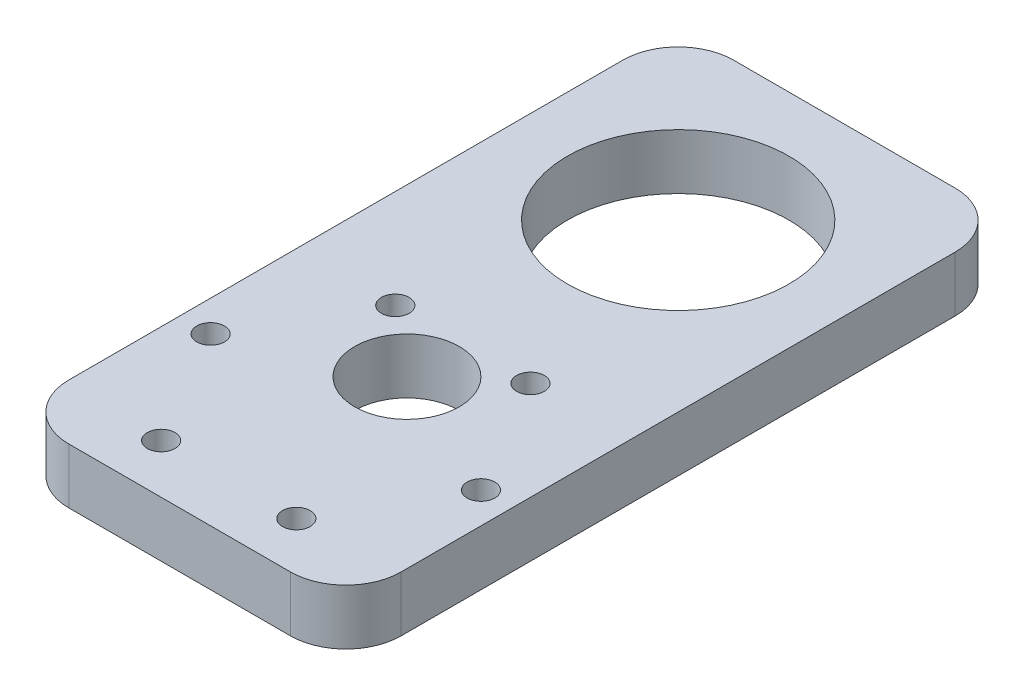
ISO-10303-21;
HEADER;
FILE_DESCRIPTION(('STEP AP214'),'2;1');
FILE_NAME('part.step','',(''),(''),'','','');
FILE_SCHEMA(('AUTOMOTIVE_DESIGN { 1 0 10303 214 1 1 1 1 }'));
ENDSEC;
DATA;
#1=APPLICATION_CONTEXT('core data for automotive mechanical design processes');
#2=APPLICATION_PROTOCOL_DEFINITION('international standard','automotive_design',2000,#1);
#3=PRODUCT_CONTEXT('',#1,'mechanical');
#4=PRODUCT('Part','Part','',(#3));
#5=PRODUCT_RELATED_PRODUCT_CATEGORY('part','',(#4));
#6=PRODUCT_DEFINITION_FORMATION('','',#4);
#7=PRODUCT_DEFINITION_CONTEXT('part definition',#1,'design');
#8=PRODUCT_DEFINITION('design','',#6,#7);
#9=PRODUCT_DEFINITION_SHAPE('','',#8);
#10=(LENGTH_UNIT() NAMED_UNIT(*) SI_UNIT(.MILLI.,.METRE.));
#11=(NAMED_UNIT(*) PLANE_ANGLE_UNIT() SI_UNIT($,.RADIAN.));
#12=(NAMED_UNIT(*) SI_UNIT($,.STERADIAN.) SOLID_ANGLE_UNIT());
#13=UNCERTAINTY_MEASURE_WITH_UNIT(LENGTH_MEASURE(1.E-05),#10,'distance_accuracy_value','');
#14=(GEOMETRIC_REPRESENTATION_CONTEXT(3) GLOBAL_UNCERTAINTY_ASSIGNED_CONTEXT((#13)) GLOBAL_UNIT_ASSIGNED_CONTEXT((#10,
#11,#12)) REPRESENTATION_CONTEXT('',''));
#15=CARTESIAN_POINT('',(0.,0.,0.));
#16=DIRECTION('',(0.,0.,1.));
#17=DIRECTION('',(1.,0.,0.));
#18=AXIS2_PLACEMENT_3D('',#15,#16,#17);
#19=CARTESIAN_POINT('',(0.,0.,0.));
#20=DIRECTION('',(0.,1.,0.));
#21=DIRECTION('',(0.,0.,1.));
#22=AXIS2_PLACEMENT_3D('',#19,#20,#21);
#23=PLANE('',#22);
#24=CARTESIAN_POINT('',(0.,0.,0.));
#25=DIRECTION('',(0.,1.,0.));
#26=DIRECTION('',(0.,0.,1.));
#27=AXIS2_PLACEMENT_3D('',#24,#25,#26);
#28=CIRCLE('',#27,12.7);
#29=CARTESIAN_POINT('',(0.,0.,12.7));
#30=VERTEX_POINT('',#29);
#31=EDGE_CURVE('E152',#30,#30,#28,.T.);
#32=ORIENTED_EDGE('',*,*,#31,.T.);
#33=EDGE_LOOP('',(#32));
#34=FACE_BOUND('',#33,.T.);
#35=CARTESIAN_POINT('',(7.747,0.,51.5181976062486));
#36=DIRECTION('',(0.,1.,0.));
#37=DIRECTION('',(0.,0.,1.));
#38=AXIS2_PLACEMENT_3D('',#35,#36,#37);
#39=CIRCLE('',#38,1.5875);
#40=CARTESIAN_POINT('',(7.747,0.,53.1056976062486));
#41=VERTEX_POINT('',#40);
#42=EDGE_CURVE('E155',#41,#41,#39,.T.);
#43=ORIENTED_EDGE('',*,*,#42,.T.);
#44=EDGE_LOOP('',(#43));
#45=FACE_BOUND('',#44,.T.);
#46=CARTESIAN_POINT('',(-7.747,0.,51.5181976062486));
#47=DIRECTION('',(0.,1.,0.));
#48=DIRECTION('',(0.,0.,1.));
#49=AXIS2_PLACEMENT_3D('',#46,#47,#48);
#50=CIRCLE('',#49,1.5875);
#51=CARTESIAN_POINT('',(-7.747,0.,53.1056976062486));
#52=VERTEX_POINT('',#51);
#53=EDGE_CURVE('E158',#52,#52,#50,.T.);
#54=ORIENTED_EDGE('',*,*,#53,.T.);
#55=EDGE_LOOP('',(#54));
#56=FACE_BOUND('',#55,.T.);
#57=CARTESIAN_POINT('',(15.494,0.,38.1));
#58=DIRECTION('',(0.,1.,0.));
#59=DIRECTION('',(0.,0.,1.));
#60=AXIS2_PLACEMENT_3D('',#57,#58,#59);
#61=CIRCLE('',#60,1.5875);
#62=CARTESIAN_POINT('',(15.494,0.,39.6875));
#63=VERTEX_POINT('',#62);
#64=EDGE_CURVE('E161',#63,#63,#61,.T.);
#65=ORIENTED_EDGE('',*,*,#64,.T.);
#66=EDGE_LOOP('',(#65));
#67=FACE_BOUND('',#66,.T.);
#68=CARTESIAN_POINT('',(-15.494,0.,38.1));
#69=DIRECTION('',(0.,1.,0.));
#70=DIRECTION('',(0.,0.,1.));
#71=AXIS2_PLACEMENT_3D('',#68,#69,#70);
#72=CIRCLE('',#71,1.5875);
#73=CARTESIAN_POINT('',(-15.494,0.,39.6875));
#74=VERTEX_POINT('',#73);
#75=EDGE_CURVE('E164',#74,#74,#72,.T.);
#76=ORIENTED_EDGE('',*,*,#75,.T.);
#77=EDGE_LOOP('',(#76));
#78=FACE_BOUND('',#77,.T.);
#79=CARTESIAN_POINT('',(7.747,0.,24.6818023937641));
#80=DIRECTION('',(0.,1.,0.));
#81=DIRECTION('',(0.,0.,1.));
#82=AXIS2_PLACEMENT_3D('',#79,#80,#81);
#83=CIRCLE('',#82,1.5875);
#84=CARTESIAN_POINT('',(7.747,0.,26.2693023937641));
#85=VERTEX_POINT('',#84);
#86=EDGE_CURVE('E167',#85,#85,#83,.T.);
#87=ORIENTED_EDGE('',*,*,#86,.T.);
#88=EDGE_LOOP('',(#87));
#89=FACE_BOUND('',#88,.T.);
#90=CARTESIAN_POINT('',(-7.747,0.,24.6818023937641));
#91=DIRECTION('',(0.,1.,0.));
#92=DIRECTION('',(0.,0.,1.));
#93=AXIS2_PLACEMENT_3D('',#90,#91,#92);
#94=CIRCLE('',#93,1.5875);
#95=CARTESIAN_POINT('',(-7.747,0.,26.2693023937641));
#96=VERTEX_POINT('',#95);
#97=EDGE_CURVE('E170',#96,#96,#94,.T.);
#98=ORIENTED_EDGE('',*,*,#97,.T.);
#99=EDGE_LOOP('',(#98));
#100=FACE_BOUND('',#99,.T.);
#101=CARTESIAN_POINT('',(0.,0.,31.0896));
#102=DIRECTION('',(0.,1.,0.));
#103=DIRECTION('',(0.,0.,1.));
#104=AXIS2_PLACEMENT_3D('',#101,#102,#103);
#105=CIRCLE('',#104,5.9944);
#106=CARTESIAN_POINT('',(0.,0.,37.084));
#107=VERTEX_POINT('',#106);
#108=EDGE_CURVE('E173',#107,#107,#105,.T.);
#109=ORIENTED_EDGE('',*,*,#108,.T.);
#110=EDGE_LOOP('',(#109));
#111=FACE_BOUND('',#110,.T.);
#112=CARTESIAN_POINT('',(12.7,0.,50.8));
#113=DIRECTION('',(0.,-1.,0.));
#114=DIRECTION('',(0.,0.,-1.));
#115=AXIS2_PLACEMENT_3D('',#112,#113,#114);
#116=CIRCLE('',#115,6.35);
#117=CARTESIAN_POINT('',(12.7,0.,57.15));
#118=VERTEX_POINT('',#117);
#119=CARTESIAN_POINT('',(19.05,0.,50.8));
#120=VERTEX_POINT('',#119);
#121=EDGE_CURVE('E179',#118,#120,#116,.F.);
#122=ORIENTED_EDGE('',*,*,#121,.F.);
#123=DIRECTION('',(1.,0.,0.));
#124=VECTOR('',#123,1.);
#125=CARTESIAN_POINT('',(-19.05,0.,57.15));
#126=LINE('',#125,#124);
#127=CARTESIAN_POINT('',(-12.7,0.,57.15));
#128=VERTEX_POINT('',#127);
#129=EDGE_CURVE('E114',#128,#118,#126,.T.);
#130=ORIENTED_EDGE('',*,*,#129,.F.);
#131=CARTESIAN_POINT('',(-12.7,0.,50.8));
#132=DIRECTION('',(0.,-1.,0.));
#133=DIRECTION('',(0.,0.,-1.));
#134=AXIS2_PLACEMENT_3D('',#131,#132,#133);
#135=CIRCLE('',#134,6.35);
#136=CARTESIAN_POINT('',(-19.05,0.,50.8));
#137=VERTEX_POINT('',#136);
#138=EDGE_CURVE('E88',#137,#128,#135,.F.);
#139=ORIENTED_EDGE('',*,*,#138,.F.);
#140=DIRECTION('',(0.,0.,1.));
#141=VECTOR('',#140,1.);
#142=CARTESIAN_POINT('',(-19.05,0.,-19.05));
#143=LINE('',#142,#141);
#144=CARTESIAN_POINT('',(-19.05,0.,-12.7));
#145=VERTEX_POINT('',#144);
#146=EDGE_CURVE('E83',#145,#137,#143,.T.);
#147=ORIENTED_EDGE('',*,*,#146,.F.);
#148=CARTESIAN_POINT('',(-12.7,0.,-12.7));
#149=DIRECTION('',(0.,-1.,0.));
#150=DIRECTION('',(0.,0.,-1.));
#151=AXIS2_PLACEMENT_3D('',#148,#149,#150);
#152=CIRCLE('',#151,6.35);
#153=CARTESIAN_POINT('',(-12.7,0.,-19.05));
#154=VERTEX_POINT('',#153);
#155=EDGE_CURVE('E20',#154,#145,#152,.F.);
#156=ORIENTED_EDGE('',*,*,#155,.F.);
#157=DIRECTION('',(-1.,0.,0.));
#158=VECTOR('',#157,1.);
#159=CARTESIAN_POINT('',(19.05,0.,-19.05));
#160=LINE('',#159,#158);
#161=CARTESIAN_POINT('',(12.7,0.,-19.05));
#162=VERTEX_POINT('',#161);
#163=EDGE_CURVE('E78',#162,#154,#160,.T.);
#164=ORIENTED_EDGE('',*,*,#163,.F.);
#165=CARTESIAN_POINT('',(12.7,0.,-12.7));
#166=DIRECTION('',(0.,-1.,0.));
#167=DIRECTION('',(0.,0.,-1.));
#168=AXIS2_PLACEMENT_3D('',#165,#166,#167);
#169=CIRCLE('',#168,6.35);
#170=CARTESIAN_POINT('',(19.05,0.,-12.7));
#171=VERTEX_POINT('',#170);
#172=EDGE_CURVE('E176',#171,#162,#169,.F.);
#173=ORIENTED_EDGE('',*,*,#172,.F.);
#174=DIRECTION('',(0.,0.,-1.));
#175=VECTOR('',#174,1.);
#176=CARTESIAN_POINT('',(19.05,0.,57.15));
#177=LINE('',#176,#175);
#178=EDGE_CURVE('E109',#120,#171,#177,.T.);
#179=ORIENTED_EDGE('',*,*,#178,.F.);
#180=EDGE_LOOP('',(#122,#130,#139,#147,#156,#164,#173,#179));
#181=FACE_BOUND('',#180,.T.);
#182=ADVANCED_FACE('F17',(#34,#45,#56,#67,#78,#89,#100,#111,#181),#23,.F.);
#183=CARTESIAN_POINT('',(19.05,0.,-19.05));
#184=DIRECTION('',(0.,0.,-1.));
#185=DIRECTION('',(-1.,0.,0.));
#186=AXIS2_PLACEMENT_3D('',#183,#184,#185);
#187=PLANE('',#186);
#188=DIRECTION('',(1.,0.,0.));
#189=VECTOR('',#188,1.);
#190=CARTESIAN_POINT('',(0.,6.35,-19.05));
#191=LINE('',#190,#189);
#192=CARTESIAN_POINT('',(12.7,6.35,-19.05));
#193=VERTEX_POINT('',#192);
#194=CARTESIAN_POINT('',(-12.7,6.35,-19.05));
#195=VERTEX_POINT('',#194);
#196=EDGE_CURVE('E151',#193,#195,#191,.F.);
#197=ORIENTED_EDGE('',*,*,#196,.F.);
#198=DIRECTION('',(0.,-1.,0.));
#199=VECTOR('',#198,1.);
#200=CARTESIAN_POINT('',(12.7,14.62786,-19.05));
#201=LINE('',#200,#199);
#202=EDGE_CURVE('E111',#162,#193,#201,.F.);
#203=ORIENTED_EDGE('',*,*,#202,.F.);
#204=ORIENTED_EDGE('',*,*,#163,.T.);
#205=DIRECTION('',(0.,-1.,0.));
#206=VECTOR('',#205,1.);
#207=CARTESIAN_POINT('',(-12.7,14.62786,-19.05));
#208=LINE('',#207,#206);
#209=EDGE_CURVE('E98',#195,#154,#208,.T.);
#210=ORIENTED_EDGE('',*,*,#209,.F.);
#211=EDGE_LOOP('',(#197,#203,#204,#210));
#212=FACE_BOUND('',#211,.T.);
#213=ADVANCED_FACE('F208',(#212),#187,.T.);
#214=CARTESIAN_POINT('',(-12.7,14.62786,-12.7));
#215=DIRECTION('',(0.,-1.,0.));
#216=DIRECTION('',(0.,0.,-1.));
#217=AXIS2_PLACEMENT_3D('',#214,#215,#216);
#218=CYLINDRICAL_SURFACE('',#217,6.35);
#219=ORIENTED_EDGE('',*,*,#209,.T.);
#220=ORIENTED_EDGE('',*,*,#155,.T.);
#221=DIRECTION('',(0.,1.,0.));
#222=VECTOR('',#221,1.);
#223=CARTESIAN_POINT('',(-19.05,0.,-12.7));
#224=LINE('',#223,#222);
#225=CARTESIAN_POINT('',(-19.05,6.35,-12.7));
#226=VERTEX_POINT('',#225);
#227=EDGE_CURVE('E92',#226,#145,#224,.F.);
#228=ORIENTED_EDGE('',*,*,#227,.F.);
#229=CARTESIAN_POINT('',(-12.7,6.35,-12.7));
#230=DIRECTION('',(0.,-1.,0.));
#231=DIRECTION('',(0.,0.,-1.));
#232=AXIS2_PLACEMENT_3D('',#229,#230,#231);
#233=CIRCLE('',#232,6.35);
#234=EDGE_CURVE('E149',#195,#226,#233,.F.);
#235=ORIENTED_EDGE('',*,*,#234,.F.);
#236=EDGE_LOOP('',(#219,#220,#228,#235));
#237=FACE_BOUND('',#236,.T.);
#238=ADVANCED_FACE('F95',(#237),#218,.T.);
#239=CARTESIAN_POINT('',(-19.05,0.,-19.05));
#240=DIRECTION('',(-1.,0.,0.));
#241=DIRECTION('',(0.,0.,1.));
#242=AXIS2_PLACEMENT_3D('',#239,#240,#241);
#243=PLANE('',#242);
#244=DIRECTION('',(0.,0.,1.));
#245=VECTOR('',#244,1.);
#246=CARTESIAN_POINT('',(-19.05,6.35,0.));
#247=LINE('',#246,#245);
#248=CARTESIAN_POINT('',(-19.05,6.35,50.8));
#249=VERTEX_POINT('',#248);
#250=EDGE_CURVE('E101',#226,#249,#247,.T.);
#251=ORIENTED_EDGE('',*,*,#250,.F.);
#252=ORIENTED_EDGE('',*,*,#227,.T.);
#253=ORIENTED_EDGE('',*,*,#146,.T.);
#254=DIRECTION('',(0.,-1.,0.));
#255=VECTOR('',#254,1.);
#256=CARTESIAN_POINT('',(-19.05,14.62786,50.8));
#257=LINE('',#256,#255);
#258=EDGE_CURVE('E103',#249,#137,#257,.T.);
#259=ORIENTED_EDGE('',*,*,#258,.F.);
#260=EDGE_LOOP('',(#251,#252,#253,#259));
#261=FACE_BOUND('',#260,.T.);
#262=ADVANCED_FACE('F99',(#261),#243,.T.);
#263=CARTESIAN_POINT('',(-12.7,14.62786,50.8));
#264=DIRECTION('',(0.,-1.,0.));
#265=DIRECTION('',(0.,0.,-1.));
#266=AXIS2_PLACEMENT_3D('',#263,#264,#265);
#267=CYLINDRICAL_SURFACE('',#266,6.35);
#268=ORIENTED_EDGE('',*,*,#258,.T.);
#269=ORIENTED_EDGE('',*,*,#138,.T.);
#270=DIRECTION('',(0.,1.,0.));
#271=VECTOR('',#270,1.);
#272=CARTESIAN_POINT('',(-12.7,0.,57.15));
#273=LINE('',#272,#271);
#274=CARTESIAN_POINT('',(-12.7,6.35,57.15));
#275=VERTEX_POINT('',#274);
#276=EDGE_CURVE('E116',#275,#128,#273,.F.);
#277=ORIENTED_EDGE('',*,*,#276,.F.);
#278=CARTESIAN_POINT('',(-12.7,6.35,50.8));
#279=DIRECTION('',(0.,-1.,0.));
#280=DIRECTION('',(0.,0.,-1.));
#281=AXIS2_PLACEMENT_3D('',#278,#279,#280);
#282=CIRCLE('',#281,6.35);
#283=EDGE_CURVE('E146',#249,#275,#282,.F.);
#284=ORIENTED_EDGE('',*,*,#283,.F.);
#285=EDGE_LOOP('',(#268,#269,#277,#284));
#286=FACE_BOUND('',#285,.T.);
#287=ADVANCED_FACE('F210',(#286),#267,.T.);
#288=CARTESIAN_POINT('',(-19.05,0.,57.15));
#289=DIRECTION('',(0.,0.,1.));
#290=DIRECTION('',(1.,0.,0.));
#291=AXIS2_PLACEMENT_3D('',#288,#289,#290);
#292=PLANE('',#291);
#293=ORIENTED_EDGE('',*,*,#129,.T.);
#294=DIRECTION('',(0.,-1.,0.));
#295=VECTOR('',#294,1.);
#296=CARTESIAN_POINT('',(12.7,14.62786,57.15));
#297=LINE('',#296,#295);
#298=CARTESIAN_POINT('',(12.7,6.35,57.15));
#299=VERTEX_POINT('',#298);
#300=EDGE_CURVE('E115',#299,#118,#297,.T.);
#301=ORIENTED_EDGE('',*,*,#300,.F.);
#302=DIRECTION('',(1.,0.,0.));
#303=VECTOR('',#302,1.);
#304=CARTESIAN_POINT('',(0.,6.35,57.15));
#305=LINE('',#304,#303);
#306=EDGE_CURVE('E145',#275,#299,#305,.T.);
#307=ORIENTED_EDGE('',*,*,#306,.F.);
#308=ORIENTED_EDGE('',*,*,#276,.T.);
#309=EDGE_LOOP('',(#293,#301,#307,#308));
#310=FACE_BOUND('',#309,.T.);
#311=ADVANCED_FACE('F211',(#310),#292,.T.);
#312=CARTESIAN_POINT('',(12.7,14.62786,50.8));
#313=DIRECTION('',(0.,-1.,0.));
#314=DIRECTION('',(0.,0.,-1.));
#315=AXIS2_PLACEMENT_3D('',#312,#313,#314);
#316=CYLINDRICAL_SURFACE('',#315,6.35);
#317=ORIENTED_EDGE('',*,*,#300,.T.);
#318=ORIENTED_EDGE('',*,*,#121,.T.);
#319=DIRECTION('',(0.,1.,0.));
#320=VECTOR('',#319,1.);
#321=CARTESIAN_POINT('',(19.05,0.,50.8));
#322=LINE('',#321,#320);
#323=CARTESIAN_POINT('',(19.05,6.35,50.8));
#324=VERTEX_POINT('',#323);
#325=EDGE_CURVE('E112',#324,#120,#322,.F.);
#326=ORIENTED_EDGE('',*,*,#325,.F.);
#327=CARTESIAN_POINT('',(12.7,6.35,50.8));
#328=DIRECTION('',(0.,-1.,0.));
#329=DIRECTION('',(0.,0.,-1.));
#330=AXIS2_PLACEMENT_3D('',#327,#328,#329);
#331=CIRCLE('',#330,6.35);
#332=EDGE_CURVE('E142',#299,#324,#331,.F.);
#333=ORIENTED_EDGE('',*,*,#332,.F.);
#334=EDGE_LOOP('',(#317,#318,#326,#333));
#335=FACE_BOUND('',#334,.T.);
#336=ADVANCED_FACE('F205',(#335),#316,.T.);
#337=CARTESIAN_POINT('',(19.05,0.,57.15));
#338=DIRECTION('',(1.,0.,0.));
#339=DIRECTION('',(0.,0.,-1.));
#340=AXIS2_PLACEMENT_3D('',#337,#338,#339);
#341=PLANE('',#340);
#342=ORIENTED_EDGE('',*,*,#178,.T.);
#343=DIRECTION('',(0.,-1.,0.));
#344=VECTOR('',#343,1.);
#345=CARTESIAN_POINT('',(19.05,14.62786,-12.7));
#346=LINE('',#345,#344);
#347=CARTESIAN_POINT('',(19.05,6.35,-12.7));
#348=VERTEX_POINT('',#347);
#349=EDGE_CURVE('E35',#348,#171,#346,.T.);
#350=ORIENTED_EDGE('',*,*,#349,.F.);
#351=DIRECTION('',(0.,0.,1.));
#352=VECTOR('',#351,1.);
#353=CARTESIAN_POINT('',(19.05,6.35,0.));
#354=LINE('',#353,#352);
#355=EDGE_CURVE('E141',#324,#348,#354,.F.);
#356=ORIENTED_EDGE('',*,*,#355,.F.);
#357=ORIENTED_EDGE('',*,*,#325,.T.);
#358=EDGE_LOOP('',(#342,#350,#356,#357));
#359=FACE_BOUND('',#358,.T.);
#360=ADVANCED_FACE('F201',(#359),#341,.T.);
#361=CARTESIAN_POINT('',(12.7,14.62786,-12.7));
#362=DIRECTION('',(0.,-1.,0.));
#363=DIRECTION('',(0.,0.,-1.));
#364=AXIS2_PLACEMENT_3D('',#361,#362,#363);
#365=CYLINDRICAL_SURFACE('',#364,6.35);
#366=ORIENTED_EDGE('',*,*,#349,.T.);
#367=ORIENTED_EDGE('',*,*,#172,.T.);
#368=ORIENTED_EDGE('',*,*,#202,.T.);
#369=CARTESIAN_POINT('',(12.7,6.35,-12.7));
#370=DIRECTION('',(0.,-1.,0.));
#371=DIRECTION('',(0.,0.,-1.));
#372=AXIS2_PLACEMENT_3D('',#369,#370,#371);
#373=CIRCLE('',#372,6.35);
#374=EDGE_CURVE('E138',#348,#193,#373,.F.);
#375=ORIENTED_EDGE('',*,*,#374,.F.);
#376=EDGE_LOOP('',(#366,#367,#368,#375));
#377=FACE_BOUND('',#376,.T.);
#378=ADVANCED_FACE('F207',(#377),#365,.T.);
#379=CARTESIAN_POINT('',(0.,0.,31.0896));
#380=DIRECTION('',(0.,1.,0.));
#381=DIRECTION('',(0.,0.,1.));
#382=AXIS2_PLACEMENT_3D('',#379,#380,#381);
#383=CYLINDRICAL_SURFACE('',#382,5.9944);
#384=CARTESIAN_POINT('',(0.,6.35,31.0896));
#385=DIRECTION('',(0.,1.,0.));
#386=DIRECTION('',(0.,0.,1.));
#387=AXIS2_PLACEMENT_3D('',#384,#385,#386);
#388=CIRCLE('',#387,5.9944);
#389=CARTESIAN_POINT('',(0.,6.35,37.084));
#390=VERTEX_POINT('',#389);
#391=EDGE_CURVE('E135',#390,#390,#388,.F.);
#392=ORIENTED_EDGE('',*,*,#391,.F.);
#393=EDGE_LOOP('',(#392));
#394=FACE_BOUND('',#393,.T.);
#395=ORIENTED_EDGE('',*,*,#108,.F.);
#396=EDGE_LOOP('',(#395));
#397=FACE_BOUND('',#396,.T.);
#398=ADVANCED_FACE('F255',(#394,#397),#383,.F.);
#399=CARTESIAN_POINT('',(-7.747,0.,24.6818023937641));
#400=DIRECTION('',(0.,1.,0.));
#401=DIRECTION('',(0.,0.,1.));
#402=AXIS2_PLACEMENT_3D('',#399,#400,#401);
#403=CYLINDRICAL_SURFACE('',#402,1.5875);
#404=CARTESIAN_POINT('',(-7.747,6.35,24.6818023937641));
#405=DIRECTION('',(0.,1.,0.));
#406=DIRECTION('',(0.,0.,1.));
#407=AXIS2_PLACEMENT_3D('',#404,#405,#406);
#408=CIRCLE('',#407,1.5875);
#409=CARTESIAN_POINT('',(-7.747,6.35,26.2693023937641));
#410=VERTEX_POINT('',#409);
#411=EDGE_CURVE('E132',#410,#410,#408,.F.);
#412=ORIENTED_EDGE('',*,*,#411,.F.);
#413=EDGE_LOOP('',(#412));
#414=FACE_BOUND('',#413,.T.);
#415=ORIENTED_EDGE('',*,*,#97,.F.);
#416=EDGE_LOOP('',(#415));
#417=FACE_BOUND('',#416,.T.);
#418=ADVANCED_FACE('F251',(#414,#417),#403,.F.);
#419=CARTESIAN_POINT('',(7.747,0.,24.6818023937641));
#420=DIRECTION('',(0.,1.,0.));
#421=DIRECTION('',(0.,0.,1.));
#422=AXIS2_PLACEMENT_3D('',#419,#420,#421);
#423=CYLINDRICAL_SURFACE('',#422,1.5875);
#424=CARTESIAN_POINT('',(7.747,6.35,24.6818023937641));
#425=DIRECTION('',(0.,1.,0.));
#426=DIRECTION('',(0.,0.,1.));
#427=AXIS2_PLACEMENT_3D('',#424,#425,#426);
#428=CIRCLE('',#427,1.5875);
#429=CARTESIAN_POINT('',(7.747,6.35,26.2693023937641));
#430=VERTEX_POINT('',#429);
#431=EDGE_CURVE('E129',#430,#430,#428,.F.);
#432=ORIENTED_EDGE('',*,*,#431,.F.);
#433=EDGE_LOOP('',(#432));
#434=FACE_BOUND('',#433,.T.);
#435=ORIENTED_EDGE('',*,*,#86,.F.);
#436=EDGE_LOOP('',(#435));
#437=FACE_BOUND('',#436,.T.);
#438=ADVANCED_FACE('F247',(#434,#437),#423,.F.);
#439=CARTESIAN_POINT('',(-15.494,0.,38.1));
#440=DIRECTION('',(0.,1.,0.));
#441=DIRECTION('',(0.,0.,1.));
#442=AXIS2_PLACEMENT_3D('',#439,#440,#441);
#443=CYLINDRICAL_SURFACE('',#442,1.5875);
#444=CARTESIAN_POINT('',(-15.494,6.35,38.1));
#445=DIRECTION('',(0.,1.,0.));
#446=DIRECTION('',(0.,0.,1.));
#447=AXIS2_PLACEMENT_3D('',#444,#445,#446);
#448=CIRCLE('',#447,1.5875);
#449=CARTESIAN_POINT('',(-15.494,6.35,39.6875));
#450=VERTEX_POINT('',#449);
#451=EDGE_CURVE('E126',#450,#450,#448,.F.);
#452=ORIENTED_EDGE('',*,*,#451,.F.);
#453=EDGE_LOOP('',(#452));
#454=FACE_BOUND('',#453,.T.);
#455=ORIENTED_EDGE('',*,*,#75,.F.);
#456=EDGE_LOOP('',(#455));
#457=FACE_BOUND('',#456,.T.);
#458=ADVANCED_FACE('F243',(#454,#457),#443,.F.);
#459=CARTESIAN_POINT('',(15.494,0.,38.1));
#460=DIRECTION('',(0.,1.,0.));
#461=DIRECTION('',(0.,0.,1.));
#462=AXIS2_PLACEMENT_3D('',#459,#460,#461);
#463=CYLINDRICAL_SURFACE('',#462,1.5875);
#464=CARTESIAN_POINT('',(15.494,6.35,38.1));
#465=DIRECTION('',(0.,1.,0.));
#466=DIRECTION('',(0.,0.,1.));
#467=AXIS2_PLACEMENT_3D('',#464,#465,#466);
#468=CIRCLE('',#467,1.5875);
#469=CARTESIAN_POINT('',(15.494,6.35,39.6875));
#470=VERTEX_POINT('',#469);
#471=EDGE_CURVE('E123',#470,#470,#468,.F.);
#472=ORIENTED_EDGE('',*,*,#471,.F.);
#473=EDGE_LOOP('',(#472));
#474=FACE_BOUND('',#473,.T.);
#475=ORIENTED_EDGE('',*,*,#64,.F.);
#476=EDGE_LOOP('',(#475));
#477=FACE_BOUND('',#476,.T.);
#478=ADVANCED_FACE('F239',(#474,#477),#463,.F.);
#479=CARTESIAN_POINT('',(-7.747,0.,51.5181976062486));
#480=DIRECTION('',(0.,1.,0.));
#481=DIRECTION('',(0.,0.,1.));
#482=AXIS2_PLACEMENT_3D('',#479,#480,#481);
#483=CYLINDRICAL_SURFACE('',#482,1.5875);
#484=CARTESIAN_POINT('',(-7.747,6.35,51.5181976062486));
#485=DIRECTION('',(0.,1.,0.));
#486=DIRECTION('',(0.,0.,1.));
#487=AXIS2_PLACEMENT_3D('',#484,#485,#486);
#488=CIRCLE('',#487,1.5875);
#489=CARTESIAN_POINT('',(-7.747,6.35,53.1056976062486));
#490=VERTEX_POINT('',#489);
#491=EDGE_CURVE('E120',#490,#490,#488,.F.);
#492=ORIENTED_EDGE('',*,*,#491,.F.);
#493=EDGE_LOOP('',(#492));
#494=FACE_BOUND('',#493,.T.);
#495=ORIENTED_EDGE('',*,*,#53,.F.);
#496=EDGE_LOOP('',(#495));
#497=FACE_BOUND('',#496,.T.);
#498=ADVANCED_FACE('F235',(#494,#497),#483,.F.);
#499=CARTESIAN_POINT('',(7.747,0.,51.5181976062486));
#500=DIRECTION('',(0.,1.,0.));
#501=DIRECTION('',(0.,0.,1.));
#502=AXIS2_PLACEMENT_3D('',#499,#500,#501);
#503=CYLINDRICAL_SURFACE('',#502,1.5875);
#504=CARTESIAN_POINT('',(7.747,6.35,51.5181976062486));
#505=DIRECTION('',(0.,1.,0.));
#506=DIRECTION('',(0.,0.,1.));
#507=AXIS2_PLACEMENT_3D('',#504,#505,#506);
#508=CIRCLE('',#507,1.5875);
#509=CARTESIAN_POINT('',(7.747,6.35,53.1056976062486));
#510=VERTEX_POINT('',#509);
#511=EDGE_CURVE('E26',#510,#510,#508,.F.);
#512=ORIENTED_EDGE('',*,*,#511,.F.);
#513=EDGE_LOOP('',(#512));
#514=FACE_BOUND('',#513,.T.);
#515=ORIENTED_EDGE('',*,*,#42,.F.);
#516=EDGE_LOOP('',(#515));
#517=FACE_BOUND('',#516,.T.);
#518=ADVANCED_FACE('F228',(#514,#517),#503,.F.);
#519=CARTESIAN_POINT('',(0.,0.,0.));
#520=DIRECTION('',(0.,1.,0.));
#521=DIRECTION('',(0.,0.,1.));
#522=AXIS2_PLACEMENT_3D('',#519,#520,#521);
#523=CYLINDRICAL_SURFACE('',#522,12.7);
#524=CARTESIAN_POINT('',(0.,6.35,0.));
#525=DIRECTION('',(0.,1.,0.));
#526=DIRECTION('',(0.,0.,1.));
#527=AXIS2_PLACEMENT_3D('',#524,#525,#526);
#528=CIRCLE('',#527,12.7);
#529=CARTESIAN_POINT('',(0.,6.35,12.7));
#530=VERTEX_POINT('',#529);
#531=EDGE_CURVE('E11',#530,#530,#528,.F.);
#532=ORIENTED_EDGE('',*,*,#531,.F.);
#533=EDGE_LOOP('',(#532));
#534=FACE_BOUND('',#533,.T.);
#535=ORIENTED_EDGE('',*,*,#31,.F.);
#536=EDGE_LOOP('',(#535));
#537=FACE_BOUND('',#536,.T.);
#538=ADVANCED_FACE('F222',(#534,#537),#523,.F.);
#539=CARTESIAN_POINT('',(0.,6.35,0.));
#540=DIRECTION('',(0.,1.,0.));
#541=DIRECTION('',(0.,0.,1.));
#542=AXIS2_PLACEMENT_3D('',#539,#540,#541);
#543=PLANE('',#542);
#544=ORIENTED_EDGE('',*,*,#531,.T.);
#545=EDGE_LOOP('',(#544));
#546=FACE_BOUND('',#545,.T.);
#547=ORIENTED_EDGE('',*,*,#511,.T.);
#548=EDGE_LOOP('',(#547));
#549=FACE_BOUND('',#548,.T.);
#550=ORIENTED_EDGE('',*,*,#491,.T.);
#551=EDGE_LOOP('',(#550));
#552=FACE_BOUND('',#551,.T.);
#553=ORIENTED_EDGE('',*,*,#471,.T.);
#554=EDGE_LOOP('',(#553));
#555=FACE_BOUND('',#554,.T.);
#556=ORIENTED_EDGE('',*,*,#451,.T.);
#557=EDGE_LOOP('',(#556));
#558=FACE_BOUND('',#557,.T.);
#559=ORIENTED_EDGE('',*,*,#431,.T.);
#560=EDGE_LOOP('',(#559));
#561=FACE_BOUND('',#560,.T.);
#562=ORIENTED_EDGE('',*,*,#411,.T.);
#563=EDGE_LOOP('',(#562));
#564=FACE_BOUND('',#563,.T.);
#565=ORIENTED_EDGE('',*,*,#391,.T.);
#566=EDGE_LOOP('',(#565));
#567=FACE_BOUND('',#566,.T.);
#568=ORIENTED_EDGE('',*,*,#355,.T.);
#569=ORIENTED_EDGE('',*,*,#374,.T.);
#570=ORIENTED_EDGE('',*,*,#196,.T.);
#571=ORIENTED_EDGE('',*,*,#234,.T.);
#572=ORIENTED_EDGE('',*,*,#250,.T.);
#573=ORIENTED_EDGE('',*,*,#283,.T.);
#574=ORIENTED_EDGE('',*,*,#306,.T.);
#575=ORIENTED_EDGE('',*,*,#332,.T.);
#576=EDGE_LOOP('',(#568,#569,#570,#571,#572,#573,#574,#575));
#577=FACE_BOUND('',#576,.T.);
#578=ADVANCED_FACE('F199',(#546,#549,#552,#555,#558,#561,#564,#567,#577),#543,.T.);
#579=CLOSED_SHELL('',(#182,#213,#238,#262,#287,#311,#336,#360,#378,#398,#418,#438,#458,#478,
#498,#518,#538,#578));
#580=MANIFOLD_SOLID_BREP('B1',#579);
#581=ADVANCED_BREP_SHAPE_REPRESENTATION('',(#18,#580),#14);
#582=SHAPE_DEFINITION_REPRESENTATION(#9,#581);
ENDSEC;
END-ISO-10303-21;
